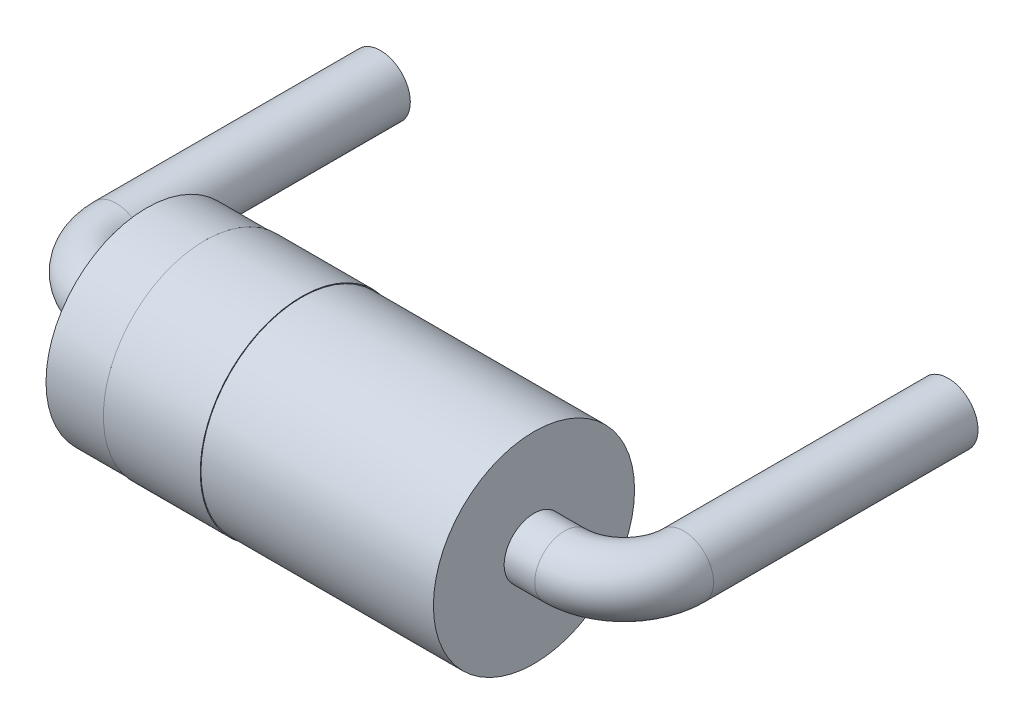
ISO-10303-21;
HEADER;
FILE_DESCRIPTION(('STEP AP214'),'2;1');
FILE_NAME('part.step','',(''),(''),'','','');
FILE_SCHEMA(('AUTOMOTIVE_DESIGN { 1 0 10303 214 1 1 1 1 }'));
ENDSEC;
DATA;
#1=APPLICATION_CONTEXT('core data for automotive mechanical design processes');
#2=APPLICATION_PROTOCOL_DEFINITION('international standard','automotive_design',2000,#1);
#3=PRODUCT_CONTEXT('',#1,'mechanical');
#4=PRODUCT('Part','Part','',(#3));
#5=PRODUCT_RELATED_PRODUCT_CATEGORY('part','',(#4));
#6=PRODUCT_DEFINITION_FORMATION('','',#4);
#7=PRODUCT_DEFINITION_CONTEXT('part definition',#1,'design');
#8=PRODUCT_DEFINITION('design','',#6,#7);
#9=PRODUCT_DEFINITION_SHAPE('','',#8);
#10=(LENGTH_UNIT() NAMED_UNIT(*) SI_UNIT(.MILLI.,.METRE.));
#11=(NAMED_UNIT(*) PLANE_ANGLE_UNIT() SI_UNIT($,.RADIAN.));
#12=(NAMED_UNIT(*) SI_UNIT($,.STERADIAN.) SOLID_ANGLE_UNIT());
#13=UNCERTAINTY_MEASURE_WITH_UNIT(LENGTH_MEASURE(1.E-05),#10,'distance_accuracy_value','');
#14=(GEOMETRIC_REPRESENTATION_CONTEXT(3) GLOBAL_UNCERTAINTY_ASSIGNED_CONTEXT((#13)) GLOBAL_UNIT_ASSIGNED_CONTEXT((#10,
#11,#12)) REPRESENTATION_CONTEXT('',''));
#15=CARTESIAN_POINT('',(0.,0.,0.));
#16=DIRECTION('',(0.,0.,1.));
#17=DIRECTION('',(1.,0.,0.));
#18=AXIS2_PLACEMENT_3D('',#15,#16,#17);
#19=CARTESIAN_POINT('',(0.4,0.,-2.5));
#20=DIRECTION('',(0.,0.,-1.));
#21=DIRECTION('',(-1.,0.,0.));
#22=AXIS2_PLACEMENT_3D('',#19,#20,#21);
#23=PLANE('',#22);
#24=CARTESIAN_POINT('',(0.,0.,-2.5));
#25=DIRECTION('',(0.,0.,1.));
#26=DIRECTION('',(0.,-1.,0.));
#27=AXIS2_PLACEMENT_3D('',#24,#25,#26);
#28=CIRCLE('',#27,0.4);
#29=CARTESIAN_POINT('',(0.,-0.4,-2.5));
#30=VERTEX_POINT('',#29);
#31=EDGE_CURVE('E18',#30,#30,#28,.T.);
#32=ORIENTED_EDGE('',*,*,#31,.F.);
#33=EDGE_LOOP('',(#32));
#34=FACE_BOUND('',#33,.T.);
#35=ADVANCED_FACE('F15',(#34),#23,.T.);
#36=CARTESIAN_POINT('',(0.,0.,1.05));
#37=DIRECTION('',(0.,0.,1.));
#38=DIRECTION('',(0.,-1.,0.));
#39=AXIS2_PLACEMENT_3D('',#36,#37,#38);
#40=CYLINDRICAL_SURFACE('',#39,0.4);
#41=CARTESIAN_POINT('',(0.,0.,1.05));
#42=DIRECTION('',(0.,0.,1.));
#43=DIRECTION('',(-1.,0.,0.));
#44=AXIS2_PLACEMENT_3D('',#41,#42,#43);
#45=CIRCLE('',#44,0.4);
#46=CARTESIAN_POINT('',(-0.4,0.,1.05));
#47=VERTEX_POINT('',#46);
#48=EDGE_CURVE('E30',#47,#47,#45,.T.);
#49=ORIENTED_EDGE('',*,*,#48,.F.);
#50=EDGE_LOOP('',(#49));
#51=FACE_BOUND('',#50,.T.);
#52=ORIENTED_EDGE('',*,*,#31,.T.);
#53=EDGE_LOOP('',(#52));
#54=FACE_BOUND('',#53,.T.);
#55=ADVANCED_FACE('F69',(#51,#54),#40,.T.);
#56=CARTESIAN_POINT('',(0.8,0.,1.05));
#57=DIRECTION('',(0.,1.,0.));
#58=DIRECTION('',(1.,0.,0.));
#59=AXIS2_PLACEMENT_3D('',#56,#57,#58);
#60=TOROIDAL_SURFACE('',#59,0.8,0.4);
#61=CARTESIAN_POINT('',(0.8,0.,1.85));
#62=DIRECTION('',(1.,0.,0.));
#63=DIRECTION('',(0.,0.,-1.));
#64=AXIS2_PLACEMENT_3D('',#61,#62,#63);
#65=CIRCLE('',#64,0.4);
#66=CARTESIAN_POINT('',(0.8,0.,1.45));
#67=VERTEX_POINT('',#66);
#68=EDGE_CURVE('E53',#67,#67,#65,.T.);
#69=ORIENTED_EDGE('',*,*,#68,.F.);
#70=EDGE_LOOP('',(#69));
#71=FACE_BOUND('',#70,.T.);
#72=ORIENTED_EDGE('',*,*,#48,.T.);
#73=EDGE_LOOP('',(#72));
#74=FACE_BOUND('',#73,.T.);
#75=ADVANCED_FACE('F65',(#71,#74),#60,.T.);
#76=CARTESIAN_POINT('',(0.8,0.,1.85));
#77=DIRECTION('',(1.,0.,0.));
#78=DIRECTION('',(0.,0.,-1.));
#79=AXIS2_PLACEMENT_3D('',#76,#77,#78);
#80=CYLINDRICAL_SURFACE('',#79,0.4);
#81=CARTESIAN_POINT('',(1.21,0.,1.85));
#82=DIRECTION('',(1.,0.,0.));
#83=DIRECTION('',(0.,0.,-1.));
#84=AXIS2_PLACEMENT_3D('',#81,#82,#83);
#85=CIRCLE('',#84,0.4);
#86=CARTESIAN_POINT('',(1.21,0.,1.45));
#87=VERTEX_POINT('',#86);
#88=EDGE_CURVE('E51',#87,#87,#85,.F.);
#89=ORIENTED_EDGE('',*,*,#88,.T.);
#90=EDGE_LOOP('',(#89));
#91=FACE_BOUND('',#90,.T.);
#92=ORIENTED_EDGE('',*,*,#68,.T.);
#93=EDGE_LOOP('',(#92));
#94=FACE_BOUND('',#93,.T.);
#95=ADVANCED_FACE('F68',(#91,#94),#80,.T.);
#96=CARTESIAN_POINT('',(1.21,0.,1.85));
#97=DIRECTION('',(1.,0.,0.));
#98=DIRECTION('',(0.,0.,-1.));
#99=AXIS2_PLACEMENT_3D('',#96,#97,#98);
#100=PLANE('',#99);
#101=ORIENTED_EDGE('',*,*,#88,.F.);
#102=EDGE_LOOP('',(#101));
#103=FACE_BOUND('',#102,.T.);
#104=CARTESIAN_POINT('',(1.21,0.,1.85));
#105=DIRECTION('',(1.,0.,0.));
#106=DIRECTION('',(0.,0.,-1.));
#107=AXIS2_PLACEMENT_3D('',#104,#105,#106);
#108=CIRCLE('',#107,1.35);
#109=CARTESIAN_POINT('',(1.21,0.,0.5));
#110=VERTEX_POINT('',#109);
#111=EDGE_CURVE('E49',#110,#110,#108,.T.);
#112=ORIENTED_EDGE('',*,*,#111,.F.);
#113=EDGE_LOOP('',(#112));
#114=FACE_BOUND('',#113,.T.);
#115=ADVANCED_FACE('F130',(#103,#114),#100,.F.);
#116=CARTESIAN_POINT('',(7.22,0.,-2.5));
#117=DIRECTION('',(0.,0.,1.));
#118=DIRECTION('',(1.,0.,0.));
#119=AXIS2_PLACEMENT_3D('',#116,#117,#118);
#120=PLANE('',#119);
#121=CARTESIAN_POINT('',(7.62,0.,-2.5));
#122=DIRECTION('',(0.,0.,-1.));
#123=DIRECTION('',(0.,1.,0.));
#124=AXIS2_PLACEMENT_3D('',#121,#122,#123);
#125=CIRCLE('',#124,0.4);
#126=CARTESIAN_POINT('',(7.62,0.4,-2.5));
#127=VERTEX_POINT('',#126);
#128=EDGE_CURVE('E46',#127,#127,#125,.F.);
#129=ORIENTED_EDGE('',*,*,#128,.F.);
#130=EDGE_LOOP('',(#129));
#131=FACE_BOUND('',#130,.T.);
#132=ADVANCED_FACE('F127',(#131),#120,.F.);
#133=CARTESIAN_POINT('',(1.21,0.,1.85));
#134=DIRECTION('',(1.,0.,0.));
#135=DIRECTION('',(0.,0.,-1.));
#136=AXIS2_PLACEMENT_3D('',#133,#134,#135);
#137=CYLINDRICAL_SURFACE('',#136,1.35);
#138=ORIENTED_EDGE('',*,*,#111,.T.);
#139=EDGE_LOOP('',(#138));
#140=FACE_BOUND('',#139,.T.);
#141=CARTESIAN_POINT('',(1.99,0.,1.85));
#142=DIRECTION('',(1.,0.,0.));
#143=DIRECTION('',(0.,0.,-1.));
#144=AXIS2_PLACEMENT_3D('',#141,#142,#143);
#145=CIRCLE('',#144,1.35);
#146=CARTESIAN_POINT('',(1.99,0.,0.5));
#147=VERTEX_POINT('',#146);
#148=EDGE_CURVE('E43',#147,#147,#145,.F.);
#149=ORIENTED_EDGE('',*,*,#148,.T.);
#150=EDGE_LOOP('',(#149));
#151=FACE_BOUND('',#150,.T.);
#152=ADVANCED_FACE('F123',(#140,#151),#137,.T.);
#153=CARTESIAN_POINT('',(7.62,0.,1.05));
#154=DIRECTION('',(0.,0.,-1.));
#155=DIRECTION('',(0.,1.,0.));
#156=AXIS2_PLACEMENT_3D('',#153,#154,#155);
#157=CYLINDRICAL_SURFACE('',#156,0.4);
#158=ORIENTED_EDGE('',*,*,#128,.T.);
#159=EDGE_LOOP('',(#158));
#160=FACE_BOUND('',#159,.T.);
#161=CARTESIAN_POINT('',(7.62,0.,1.05));
#162=DIRECTION('',(0.,0.,-1.));
#163=DIRECTION('',(1.,0.,0.));
#164=AXIS2_PLACEMENT_3D('',#161,#162,#163);
#165=CIRCLE('',#164,0.4);
#166=CARTESIAN_POINT('',(8.02,0.,1.05));
#167=VERTEX_POINT('',#166);
#168=EDGE_CURVE('E42',#167,#167,#165,.F.);
#169=ORIENTED_EDGE('',*,*,#168,.F.);
#170=EDGE_LOOP('',(#169));
#171=FACE_BOUND('',#170,.T.);
#172=ADVANCED_FACE('F119',(#160,#171),#157,.T.);
#173=CARTESIAN_POINT('',(1.99,0.,1.85));
#174=DIRECTION('',(1.,0.,0.));
#175=DIRECTION('',(0.,0.,-1.));
#176=AXIS2_PLACEMENT_3D('',#173,#174,#175);
#177=PLANE('',#176);
#178=ORIENTED_EDGE('',*,*,#148,.F.);
#179=EDGE_LOOP('',(#178));
#180=FACE_BOUND('',#179,.T.);
#181=CARTESIAN_POINT('',(1.99,0.,1.85));
#182=DIRECTION('',(1.,0.,0.));
#183=DIRECTION('',(0.,0.,-1.));
#184=AXIS2_PLACEMENT_3D('',#181,#182,#183);
#185=CIRCLE('',#184,1.36);
#186=CARTESIAN_POINT('',(1.99,0.,0.49));
#187=VERTEX_POINT('',#186);
#188=EDGE_CURVE('E39',#187,#187,#185,.T.);
#189=ORIENTED_EDGE('',*,*,#188,.F.);
#190=EDGE_LOOP('',(#189));
#191=FACE_BOUND('',#190,.T.);
#192=ADVANCED_FACE('F107',(#180,#191),#177,.F.);
#193=CARTESIAN_POINT('',(6.82,0.,1.05));
#194=DIRECTION('',(0.,1.,0.));
#195=DIRECTION('',(1.,0.,0.));
#196=AXIS2_PLACEMENT_3D('',#193,#194,#195);
#197=TOROIDAL_SURFACE('',#196,0.8,0.4);
#198=ORIENTED_EDGE('',*,*,#168,.T.);
#199=EDGE_LOOP('',(#198));
#200=FACE_BOUND('',#199,.T.);
#201=CARTESIAN_POINT('',(6.82,0.,1.85));
#202=DIRECTION('',(1.,0.,0.));
#203=DIRECTION('',(0.,0.,-1.));
#204=AXIS2_PLACEMENT_3D('',#201,#202,#203);
#205=CIRCLE('',#204,0.4);
#206=CARTESIAN_POINT('',(6.82,0.,1.45));
#207=VERTEX_POINT('',#206);
#208=EDGE_CURVE('E38',#207,#207,#205,.F.);
#209=ORIENTED_EDGE('',*,*,#208,.F.);
#210=EDGE_LOOP('',(#209));
#211=FACE_BOUND('',#210,.T.);
#212=ADVANCED_FACE('F103',(#200,#211),#197,.T.);
#213=CARTESIAN_POINT('',(1.99,0.,1.85));
#214=DIRECTION('',(1.,0.,0.));
#215=DIRECTION('',(0.,0.,-1.));
#216=AXIS2_PLACEMENT_3D('',#213,#214,#215);
#217=CYLINDRICAL_SURFACE('',#216,1.36);
#218=CARTESIAN_POINT('',(3.29,0.,1.85));
#219=DIRECTION('',(1.,0.,0.));
#220=DIRECTION('',(0.,0.,-1.));
#221=AXIS2_PLACEMENT_3D('',#218,#219,#220);
#222=CIRCLE('',#221,1.36);
#223=CARTESIAN_POINT('',(3.29,0.,0.49));
#224=VERTEX_POINT('',#223);
#225=EDGE_CURVE('E35',#224,#224,#222,.T.);
#226=ORIENTED_EDGE('',*,*,#225,.F.);
#227=EDGE_LOOP('',(#226));
#228=FACE_BOUND('',#227,.T.);
#229=ORIENTED_EDGE('',*,*,#188,.T.);
#230=EDGE_LOOP('',(#229));
#231=FACE_BOUND('',#230,.T.);
#232=ADVANCED_FACE('F99',(#228,#231),#217,.T.);
#233=CARTESIAN_POINT('',(0.8,0.,1.85));
#234=DIRECTION('',(1.,0.,0.));
#235=DIRECTION('',(0.,0.,-1.));
#236=AXIS2_PLACEMENT_3D('',#233,#234,#235);
#237=CYLINDRICAL_SURFACE('',#236,0.4);
#238=ORIENTED_EDGE('',*,*,#208,.T.);
#239=EDGE_LOOP('',(#238));
#240=FACE_BOUND('',#239,.T.);
#241=CARTESIAN_POINT('',(6.41,0.,1.85));
#242=DIRECTION('',(1.,0.,0.));
#243=DIRECTION('',(0.,0.,-1.));
#244=AXIS2_PLACEMENT_3D('',#241,#242,#243);
#245=CIRCLE('',#244,0.4);
#246=CARTESIAN_POINT('',(6.41,0.,1.45));
#247=VERTEX_POINT('',#246);
#248=EDGE_CURVE('E27',#247,#247,#245,.F.);
#249=ORIENTED_EDGE('',*,*,#248,.F.);
#250=EDGE_LOOP('',(#249));
#251=FACE_BOUND('',#250,.T.);
#252=ADVANCED_FACE('F95',(#240,#251),#237,.T.);
#253=CARTESIAN_POINT('',(3.29,0.,1.85));
#254=DIRECTION('',(1.,0.,0.));
#255=DIRECTION('',(0.,0.,-1.));
#256=AXIS2_PLACEMENT_3D('',#253,#254,#255);
#257=PLANE('',#256);
#258=CARTESIAN_POINT('',(3.29,0.,1.85));
#259=DIRECTION('',(1.,0.,0.));
#260=DIRECTION('',(0.,0.,-1.));
#261=AXIS2_PLACEMENT_3D('',#258,#259,#260);
#262=CIRCLE('',#261,1.35);
#263=CARTESIAN_POINT('',(3.29,0.,0.5));
#264=VERTEX_POINT('',#263);
#265=EDGE_CURVE('E22',#264,#264,#262,.T.);
#266=ORIENTED_EDGE('',*,*,#265,.F.);
#267=EDGE_LOOP('',(#266));
#268=FACE_BOUND('',#267,.T.);
#269=ORIENTED_EDGE('',*,*,#225,.T.);
#270=EDGE_LOOP('',(#269));
#271=FACE_BOUND('',#270,.T.);
#272=ADVANCED_FACE('F88',(#268,#271),#257,.T.);
#273=CARTESIAN_POINT('',(6.41,0.,1.85));
#274=DIRECTION('',(1.,0.,0.));
#275=DIRECTION('',(0.,0.,-1.));
#276=AXIS2_PLACEMENT_3D('',#273,#274,#275);
#277=PLANE('',#276);
#278=ORIENTED_EDGE('',*,*,#248,.T.);
#279=EDGE_LOOP('',(#278));
#280=FACE_BOUND('',#279,.T.);
#281=CARTESIAN_POINT('',(6.41,0.,1.85));
#282=DIRECTION('',(1.,0.,0.));
#283=DIRECTION('',(0.,0.,-1.));
#284=AXIS2_PLACEMENT_3D('',#281,#282,#283);
#285=CIRCLE('',#284,1.35);
#286=CARTESIAN_POINT('',(6.41,0.,0.5));
#287=VERTEX_POINT('',#286);
#288=EDGE_CURVE('E10',#287,#287,#285,.F.);
#289=ORIENTED_EDGE('',*,*,#288,.F.);
#290=EDGE_LOOP('',(#289));
#291=FACE_BOUND('',#290,.T.);
#292=ADVANCED_FACE('F83',(#280,#291),#277,.T.);
#293=CARTESIAN_POINT('',(1.21,0.,1.85));
#294=DIRECTION('',(1.,0.,0.));
#295=DIRECTION('',(0.,0.,-1.));
#296=AXIS2_PLACEMENT_3D('',#293,#294,#295);
#297=CYLINDRICAL_SURFACE('',#296,1.35);
#298=ORIENTED_EDGE('',*,*,#288,.T.);
#299=EDGE_LOOP('',(#298));
#300=FACE_BOUND('',#299,.T.);
#301=ORIENTED_EDGE('',*,*,#265,.T.);
#302=EDGE_LOOP('',(#301));
#303=FACE_BOUND('',#302,.T.);
#304=ADVANCED_FACE('F81',(#300,#303),#297,.T.);
#305=CLOSED_SHELL('',(#35,#55,#75,#95,#115,#132,#152,#172,#192,#212,#232,#252,#272,#292,#304));
#306=MANIFOLD_SOLID_BREP('B1',#305);
#307=ADVANCED_BREP_SHAPE_REPRESENTATION('',(#18,#306),#14);
#308=SHAPE_DEFINITION_REPRESENTATION(#9,#307);
ENDSEC;
END-ISO-10303-21;
